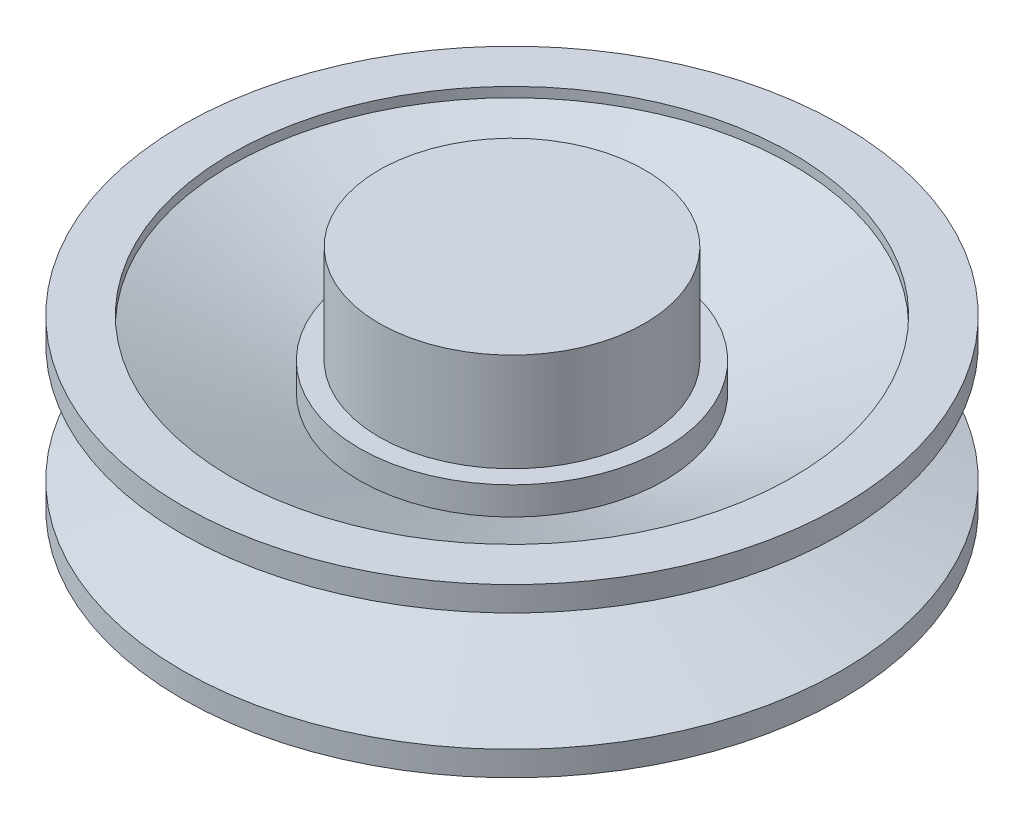
ISO-10303-21;
HEADER;
FILE_DESCRIPTION(('STEP AP214'),'2;1');
FILE_NAME('part.step','',(''),(''),'','','');
FILE_SCHEMA(('AUTOMOTIVE_DESIGN { 1 0 10303 214 1 1 1 1 }'));
ENDSEC;
DATA;
#1=APPLICATION_CONTEXT('core data for automotive mechanical design processes');
#2=APPLICATION_PROTOCOL_DEFINITION('international standard','automotive_design',2000,#1);
#3=PRODUCT_CONTEXT('',#1,'mechanical');
#4=PRODUCT('Part','Part','',(#3));
#5=PRODUCT_RELATED_PRODUCT_CATEGORY('part','',(#4));
#6=PRODUCT_DEFINITION_FORMATION('','',#4);
#7=PRODUCT_DEFINITION_CONTEXT('part definition',#1,'design');
#8=PRODUCT_DEFINITION('design','',#6,#7);
#9=PRODUCT_DEFINITION_SHAPE('','',#8);
#10=(LENGTH_UNIT() NAMED_UNIT(*) SI_UNIT(.MILLI.,.METRE.));
#11=(NAMED_UNIT(*) PLANE_ANGLE_UNIT() SI_UNIT($,.RADIAN.));
#12=(NAMED_UNIT(*) SI_UNIT($,.STERADIAN.) SOLID_ANGLE_UNIT());
#13=UNCERTAINTY_MEASURE_WITH_UNIT(LENGTH_MEASURE(1.E-05),#10,'distance_accuracy_value','');
#14=(GEOMETRIC_REPRESENTATION_CONTEXT(3) GLOBAL_UNCERTAINTY_ASSIGNED_CONTEXT((#13)) GLOBAL_UNIT_ASSIGNED_CONTEXT((#10,
#11,#12)) REPRESENTATION_CONTEXT('',''));
#15=CARTESIAN_POINT('',(0.,0.,0.));
#16=DIRECTION('',(0.,0.,1.));
#17=DIRECTION('',(1.,0.,0.));
#18=AXIS2_PLACEMENT_3D('',#15,#16,#17);
#19=CARTESIAN_POINT('',(0.,-25.,31.));
#20=DIRECTION('',(0.,-1.,0.));
#21=DIRECTION('',(0.,0.,-1.));
#22=AXIS2_PLACEMENT_3D('',#19,#20,#21);
#23=PLANE('',#22);
#24=CARTESIAN_POINT('',(0.,-25.,0.));
#25=DIRECTION('',(0.,1.,0.));
#26=DIRECTION('',(0.,0.,1.));
#27=AXIS2_PLACEMENT_3D('',#24,#25,#26);
#28=CIRCLE('',#27,31.);
#29=CARTESIAN_POINT('',(0.,-25.,31.));
#30=VERTEX_POINT('',#29);
#31=EDGE_CURVE('E10',#30,#30,#28,.T.);
#32=ORIENTED_EDGE('',*,*,#31,.F.);
#33=EDGE_LOOP('',(#32));
#34=FACE_BOUND('',#33,.T.);
#35=ADVANCED_FACE('F38',(#34),#23,.T.);
#36=CARTESIAN_POINT('',(0.,25.,0.));
#37=DIRECTION('',(0.,1.,0.));
#38=DIRECTION('',(0.,0.,1.));
#39=AXIS2_PLACEMENT_3D('',#36,#37,#38);
#40=CYLINDRICAL_SURFACE('',#39,31.);
#41=ORIENTED_EDGE('',*,*,#31,.T.);
#42=EDGE_LOOP('',(#41));
#43=FACE_BOUND('',#42,.T.);
#44=CARTESIAN_POINT('',(0.,-11.6390491787389,0.));
#45=DIRECTION('',(0.,1.,0.));
#46=DIRECTION('',(0.,0.,1.));
#47=AXIS2_PLACEMENT_3D('',#44,#45,#46);
#48=CIRCLE('',#47,31.);
#49=CARTESIAN_POINT('',(0.,-11.6390491787389,31.));
#50=VERTEX_POINT('',#49);
#51=EDGE_CURVE('E44',#50,#50,#48,.T.);
#52=ORIENTED_EDGE('',*,*,#51,.F.);
#53=EDGE_LOOP('',(#52));
#54=FACE_BOUND('',#53,.T.);
#55=ADVANCED_FACE('F110',(#43,#54),#40,.T.);
#56=CARTESIAN_POINT('',(0.,-19.0964812724878,0.));
#57=DIRECTION('',(0.,-1.,0.));
#58=DIRECTION('',(0.,0.,-1.));
#59=AXIS2_PLACEMENT_3D('',#56,#57,#58);
#60=CONICAL_SURFACE('',#59,57.,1.29147071890475);
#61=ORIENTED_EDGE('',*,*,#51,.T.);
#62=EDGE_LOOP('',(#61));
#63=FACE_BOUND('',#62,.T.);
#64=CARTESIAN_POINT('',(0.,-19.0964812724878,0.));
#65=DIRECTION('',(0.,1.,0.));
#66=DIRECTION('',(0.,0.,1.));
#67=AXIS2_PLACEMENT_3D('',#64,#65,#66);
#68=CIRCLE('',#67,57.);
#69=CARTESIAN_POINT('',(0.,-19.0964812724878,57.));
#70=VERTEX_POINT('',#69);
#71=EDGE_CURVE('E48',#70,#70,#68,.T.);
#72=ORIENTED_EDGE('',*,*,#71,.F.);
#73=EDGE_LOOP('',(#72));
#74=FACE_BOUND('',#73,.T.);
#75=ADVANCED_FACE('F115',(#63,#74),#60,.F.);
#76=CARTESIAN_POINT('',(0.,25.,0.));
#77=DIRECTION('',(0.,1.,0.));
#78=DIRECTION('',(0.,0.,1.));
#79=AXIS2_PLACEMENT_3D('',#76,#77,#78);
#80=CYLINDRICAL_SURFACE('',#79,57.);
#81=ORIENTED_EDGE('',*,*,#71,.T.);
#82=EDGE_LOOP('',(#81));
#83=FACE_BOUND('',#82,.T.);
#84=CARTESIAN_POINT('',(0.,-21.0964812724878,0.));
#85=DIRECTION('',(0.,1.,0.));
#86=DIRECTION('',(0.,0.,1.));
#87=AXIS2_PLACEMENT_3D('',#84,#85,#86);
#88=CIRCLE('',#87,57.);
#89=CARTESIAN_POINT('',(0.,-21.0964812724878,57.));
#90=VERTEX_POINT('',#89);
#91=EDGE_CURVE('E52',#90,#90,#88,.T.);
#92=ORIENTED_EDGE('',*,*,#91,.F.);
#93=EDGE_LOOP('',(#92));
#94=FACE_BOUND('',#93,.T.);
#95=ADVANCED_FACE('F119',(#83,#94),#80,.F.);
#96=CARTESIAN_POINT('',(0.,-21.0964812724878,67.));
#97=DIRECTION('',(0.,-1.,0.));
#98=DIRECTION('',(0.,0.,-1.));
#99=AXIS2_PLACEMENT_3D('',#96,#97,#98);
#100=PLANE('',#99);
#101=ORIENTED_EDGE('',*,*,#91,.T.);
#102=EDGE_LOOP('',(#101));
#103=FACE_BOUND('',#102,.T.);
#104=CARTESIAN_POINT('',(0.,-21.0964812724878,0.));
#105=DIRECTION('',(0.,1.,0.));
#106=DIRECTION('',(0.,0.,1.));
#107=AXIS2_PLACEMENT_3D('',#104,#105,#106);
#108=CIRCLE('',#107,67.);
#109=CARTESIAN_POINT('',(0.,-21.0964812724878,67.));
#110=VERTEX_POINT('',#109);
#111=EDGE_CURVE('E57',#110,#110,#108,.T.);
#112=ORIENTED_EDGE('',*,*,#111,.F.);
#113=EDGE_LOOP('',(#112));
#114=FACE_BOUND('',#113,.T.);
#115=ADVANCED_FACE('F125',(#103,#114),#100,.T.);
#116=CARTESIAN_POINT('',(0.,25.,0.));
#117=DIRECTION('',(0.,1.,0.));
#118=DIRECTION('',(0.,0.,1.));
#119=AXIS2_PLACEMENT_3D('',#116,#117,#118);
#120=CYLINDRICAL_SURFACE('',#119,67.);
#121=ORIENTED_EDGE('',*,*,#111,.T.);
#122=EDGE_LOOP('',(#121));
#123=FACE_BOUND('',#122,.T.);
#124=CARTESIAN_POINT('',(0.,-16.0964812724878,0.));
#125=DIRECTION('',(0.,1.,0.));
#126=DIRECTION('',(0.,0.,1.));
#127=AXIS2_PLACEMENT_3D('',#124,#125,#126);
#128=CIRCLE('',#127,67.);
#129=CARTESIAN_POINT('',(0.,-16.0964812724878,67.));
#130=VERTEX_POINT('',#129);
#131=EDGE_CURVE('E60',#130,#130,#128,.T.);
#132=ORIENTED_EDGE('',*,*,#131,.F.);
#133=EDGE_LOOP('',(#132));
#134=FACE_BOUND('',#133,.T.);
#135=ADVANCED_FACE('F129',(#123,#134),#120,.T.);
#136=CARTESIAN_POINT('',(0.,-8.92587349003692,0.));
#137=DIRECTION('',(0.,-1.,0.));
#138=DIRECTION('',(0.,0.,-1.));
#139=AXIS2_PLACEMENT_3D('',#136,#137,#138);
#140=CONICAL_SURFACE('',#139,42.,1.29147071890475);
#141=ORIENTED_EDGE('',*,*,#131,.T.);
#142=EDGE_LOOP('',(#141));
#143=FACE_BOUND('',#142,.T.);
#144=CARTESIAN_POINT('',(0.,-8.92587349003692,0.));
#145=DIRECTION('',(0.,1.,0.));
#146=DIRECTION('',(0.,0.,1.));
#147=AXIS2_PLACEMENT_3D('',#144,#145,#146);
#148=CIRCLE('',#147,42.);
#149=CARTESIAN_POINT('',(0.,-8.92587349003693,42.));
#150=VERTEX_POINT('',#149);
#151=EDGE_CURVE('E63',#150,#150,#148,.T.);
#152=ORIENTED_EDGE('',*,*,#151,.F.);
#153=EDGE_LOOP('',(#152));
#154=FACE_BOUND('',#153,.T.);
#155=ADVANCED_FACE('F133',(#143,#154),#140,.T.);
#156=CARTESIAN_POINT('',(0.,25.,0.));
#157=DIRECTION('',(0.,1.,0.));
#158=DIRECTION('',(0.,0.,1.));
#159=AXIS2_PLACEMENT_3D('',#156,#157,#158);
#160=CYLINDRICAL_SURFACE('',#159,42.);
#161=ORIENTED_EDGE('',*,*,#151,.T.);
#162=EDGE_LOOP('',(#161));
#163=FACE_BOUND('',#162,.T.);
#164=CARTESIAN_POINT('',(0.,-3.22501387862572,0.));
#165=DIRECTION('',(0.,1.,0.));
#166=DIRECTION('',(0.,0.,1.));
#167=AXIS2_PLACEMENT_3D('',#164,#165,#166);
#168=CIRCLE('',#167,42.);
#169=CARTESIAN_POINT('',(0.,-3.22501387862573,42.));
#170=VERTEX_POINT('',#169);
#171=EDGE_CURVE('E66',#170,#170,#168,.T.);
#172=ORIENTED_EDGE('',*,*,#171,.F.);
#173=EDGE_LOOP('',(#172));
#174=FACE_BOUND('',#173,.T.);
#175=ADVANCED_FACE('F137',(#163,#174),#160,.T.);
#176=CARTESIAN_POINT('',(0.,7.90351872751222,0.));
#177=DIRECTION('',(0.,1.,0.));
#178=DIRECTION('',(0.,0.,1.));
#179=AXIS2_PLACEMENT_3D('',#176,#177,#178);
#180=CONICAL_SURFACE('',#179,67.,1.15199023388732);
#181=ORIENTED_EDGE('',*,*,#171,.T.);
#182=EDGE_LOOP('',(#181));
#183=FACE_BOUND('',#182,.T.);
#184=CARTESIAN_POINT('',(0.,7.90351872751222,0.));
#185=DIRECTION('',(0.,1.,0.));
#186=DIRECTION('',(0.,0.,1.));
#187=AXIS2_PLACEMENT_3D('',#184,#185,#186);
#188=CIRCLE('',#187,67.);
#189=CARTESIAN_POINT('',(0.,7.9035187275122,67.));
#190=VERTEX_POINT('',#189);
#191=EDGE_CURVE('E69',#190,#190,#188,.T.);
#192=ORIENTED_EDGE('',*,*,#191,.F.);
#193=EDGE_LOOP('',(#192));
#194=FACE_BOUND('',#193,.T.);
#195=ADVANCED_FACE('F141',(#183,#194),#180,.T.);
#196=CARTESIAN_POINT('',(0.,25.,0.));
#197=DIRECTION('',(0.,1.,0.));
#198=DIRECTION('',(0.,0.,1.));
#199=AXIS2_PLACEMENT_3D('',#196,#197,#198);
#200=CYLINDRICAL_SURFACE('',#199,67.);
#201=ORIENTED_EDGE('',*,*,#191,.T.);
#202=EDGE_LOOP('',(#201));
#203=FACE_BOUND('',#202,.T.);
#204=CARTESIAN_POINT('',(0.,12.9035187275122,0.));
#205=DIRECTION('',(0.,1.,0.));
#206=DIRECTION('',(0.,0.,1.));
#207=AXIS2_PLACEMENT_3D('',#204,#205,#206);
#208=CIRCLE('',#207,67.);
#209=CARTESIAN_POINT('',(0.,12.9035187275122,67.));
#210=VERTEX_POINT('',#209);
#211=EDGE_CURVE('E72',#210,#210,#208,.T.);
#212=ORIENTED_EDGE('',*,*,#211,.F.);
#213=EDGE_LOOP('',(#212));
#214=FACE_BOUND('',#213,.T.);
#215=ADVANCED_FACE('F145',(#203,#214),#200,.T.);
#216=CARTESIAN_POINT('',(0.,12.9035187275122,57.));
#217=DIRECTION('',(0.,1.,0.));
#218=DIRECTION('',(0.,0.,1.));
#219=AXIS2_PLACEMENT_3D('',#216,#217,#218);
#220=PLANE('',#219);
#221=ORIENTED_EDGE('',*,*,#211,.T.);
#222=EDGE_LOOP('',(#221));
#223=FACE_BOUND('',#222,.T.);
#224=CARTESIAN_POINT('',(0.,12.9035187275122,0.));
#225=DIRECTION('',(0.,1.,0.));
#226=DIRECTION('',(0.,0.,1.));
#227=AXIS2_PLACEMENT_3D('',#224,#225,#226);
#228=CIRCLE('',#227,57.);
#229=CARTESIAN_POINT('',(0.,12.9035187275122,57.));
#230=VERTEX_POINT('',#229);
#231=EDGE_CURVE('E75',#230,#230,#228,.T.);
#232=ORIENTED_EDGE('',*,*,#231,.F.);
#233=EDGE_LOOP('',(#232));
#234=FACE_BOUND('',#233,.T.);
#235=ADVANCED_FACE('F149',(#223,#234),#220,.T.);
#236=CARTESIAN_POINT('',(0.,25.,0.));
#237=DIRECTION('',(0.,1.,0.));
#238=DIRECTION('',(0.,0.,1.));
#239=AXIS2_PLACEMENT_3D('',#236,#237,#238);
#240=CYLINDRICAL_SURFACE('',#239,57.);
#241=ORIENTED_EDGE('',*,*,#231,.T.);
#242=EDGE_LOOP('',(#241));
#243=FACE_BOUND('',#242,.T.);
#244=CARTESIAN_POINT('',(0.,10.9035187275122,0.));
#245=DIRECTION('',(0.,1.,0.));
#246=DIRECTION('',(0.,0.,1.));
#247=AXIS2_PLACEMENT_3D('',#244,#245,#246);
#248=CIRCLE('',#247,57.);
#249=CARTESIAN_POINT('',(0.,10.9035187275122,57.));
#250=VERTEX_POINT('',#249);
#251=EDGE_CURVE('E78',#250,#250,#248,.T.);
#252=ORIENTED_EDGE('',*,*,#251,.F.);
#253=EDGE_LOOP('',(#252));
#254=FACE_BOUND('',#253,.T.);
#255=ADVANCED_FACE('F153',(#243,#254),#240,.F.);
#256=CARTESIAN_POINT('',(0.,-0.670155182871224,0.));
#257=DIRECTION('',(0.,1.,0.));
#258=DIRECTION('',(0.,0.,1.));
#259=AXIS2_PLACEMENT_3D('',#256,#257,#258);
#260=CONICAL_SURFACE('',#259,31.,1.15199023388732);
#261=ORIENTED_EDGE('',*,*,#251,.T.);
#262=EDGE_LOOP('',(#261));
#263=FACE_BOUND('',#262,.T.);
#264=CARTESIAN_POINT('',(0.,-0.670155182871224,0.));
#265=DIRECTION('',(0.,1.,0.));
#266=DIRECTION('',(0.,0.,1.));
#267=AXIS2_PLACEMENT_3D('',#264,#265,#266);
#268=CIRCLE('',#267,31.);
#269=CARTESIAN_POINT('',(0.,-0.670155182871233,31.));
#270=VERTEX_POINT('',#269);
#271=EDGE_CURVE('E81',#270,#270,#268,.T.);
#272=ORIENTED_EDGE('',*,*,#271,.F.);
#273=EDGE_LOOP('',(#272));
#274=FACE_BOUND('',#273,.T.);
#275=ADVANCED_FACE('F157',(#263,#274),#260,.F.);
#276=CARTESIAN_POINT('',(0.,25.,0.));
#277=DIRECTION('',(0.,1.,0.));
#278=DIRECTION('',(0.,0.,1.));
#279=AXIS2_PLACEMENT_3D('',#276,#277,#278);
#280=CYLINDRICAL_SURFACE('',#279,31.);
#281=ORIENTED_EDGE('',*,*,#271,.T.);
#282=EDGE_LOOP('',(#281));
#283=FACE_BOUND('',#282,.T.);
#284=CARTESIAN_POINT('',(0.,4.99999999999999,0.));
#285=DIRECTION('',(0.,1.,0.));
#286=DIRECTION('',(0.,0.,1.));
#287=AXIS2_PLACEMENT_3D('',#284,#285,#286);
#288=CIRCLE('',#287,31.);
#289=CARTESIAN_POINT('',(0.,4.99999999999998,31.));
#290=VERTEX_POINT('',#289);
#291=EDGE_CURVE('E84',#290,#290,#288,.T.);
#292=ORIENTED_EDGE('',*,*,#291,.F.);
#293=EDGE_LOOP('',(#292));
#294=FACE_BOUND('',#293,.T.);
#295=ADVANCED_FACE('F106',(#283,#294),#280,.T.);
#296=CARTESIAN_POINT('',(0.,4.99999999999998,27.));
#297=DIRECTION('',(0.,1.,0.));
#298=DIRECTION('',(0.,0.,1.));
#299=AXIS2_PLACEMENT_3D('',#296,#297,#298);
#300=PLANE('',#299);
#301=ORIENTED_EDGE('',*,*,#291,.T.);
#302=EDGE_LOOP('',(#301));
#303=FACE_BOUND('',#302,.T.);
#304=CARTESIAN_POINT('',(0.,4.99999999999999,0.));
#305=DIRECTION('',(0.,1.,0.));
#306=DIRECTION('',(0.,0.,1.));
#307=AXIS2_PLACEMENT_3D('',#304,#305,#306);
#308=CIRCLE('',#307,27.);
#309=CARTESIAN_POINT('',(0.,4.99999999999998,27.));
#310=VERTEX_POINT('',#309);
#311=EDGE_CURVE('E87',#310,#310,#308,.T.);
#312=ORIENTED_EDGE('',*,*,#311,.F.);
#313=EDGE_LOOP('',(#312));
#314=FACE_BOUND('',#313,.T.);
#315=ADVANCED_FACE('F98',(#303,#314),#300,.T.);
#316=CARTESIAN_POINT('',(0.,25.,0.));
#317=DIRECTION('',(0.,1.,0.));
#318=DIRECTION('',(0.,0.,1.));
#319=AXIS2_PLACEMENT_3D('',#316,#317,#318);
#320=CYLINDRICAL_SURFACE('',#319,27.);
#321=ORIENTED_EDGE('',*,*,#311,.T.);
#322=EDGE_LOOP('',(#321));
#323=FACE_BOUND('',#322,.T.);
#324=CARTESIAN_POINT('',(0.,25.,0.));
#325=DIRECTION('',(0.,1.,0.));
#326=DIRECTION('',(0.,0.,1.));
#327=AXIS2_PLACEMENT_3D('',#324,#325,#326);
#328=CIRCLE('',#327,27.);
#329=CARTESIAN_POINT('',(0.,25.,27.));
#330=VERTEX_POINT('',#329);
#331=EDGE_CURVE('E90',#330,#330,#328,.T.);
#332=ORIENTED_EDGE('',*,*,#331,.F.);
#333=EDGE_LOOP('',(#332));
#334=FACE_BOUND('',#333,.T.);
#335=ADVANCED_FACE('F96',(#323,#334),#320,.T.);
#336=CARTESIAN_POINT('',(0.,25.,0.));
#337=DIRECTION('',(0.,1.,0.));
#338=DIRECTION('',(0.,0.,1.));
#339=AXIS2_PLACEMENT_3D('',#336,#337,#338);
#340=PLANE('',#339);
#341=ORIENTED_EDGE('',*,*,#331,.T.);
#342=EDGE_LOOP('',(#341));
#343=FACE_BOUND('',#342,.T.);
#344=ADVANCED_FACE('F94',(#343),#340,.T.);
#345=CLOSED_SHELL('',(#35,#55,#75,#95,#115,#135,#155,#175,#195,#215,#235,#255,#275,#295,#315,
#335,#344));
#346=MANIFOLD_SOLID_BREP('B2',#345);
#347=ADVANCED_BREP_SHAPE_REPRESENTATION('',(#18,#346),#14);
#348=SHAPE_DEFINITION_REPRESENTATION(#9,#347);
ENDSEC;
END-ISO-10303-21;
